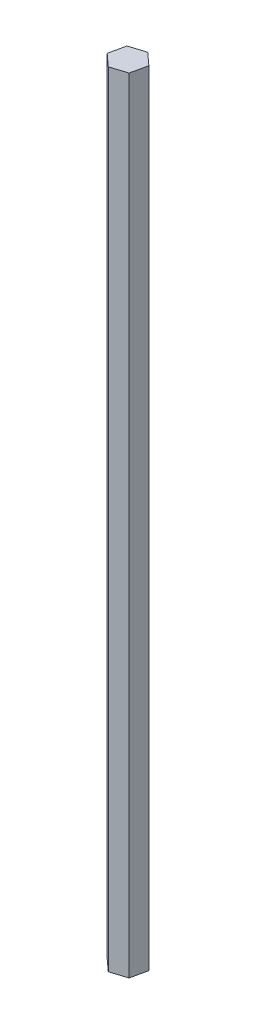
ISO-10303-21;
HEADER;
FILE_DESCRIPTION(('STEP AP214'),'2;1');
FILE_NAME('part.step','',(''),(''),'','','');
FILE_SCHEMA(('AUTOMOTIVE_DESIGN { 1 0 10303 214 1 1 1 1 }'));
ENDSEC;
DATA;
#1=APPLICATION_CONTEXT('core data for automotive mechanical design processes');
#2=APPLICATION_PROTOCOL_DEFINITION('international standard','automotive_design',2000,#1);
#3=PRODUCT_CONTEXT('',#1,'mechanical');
#4=PRODUCT('Part','Part','',(#3));
#5=PRODUCT_RELATED_PRODUCT_CATEGORY('part','',(#4));
#6=PRODUCT_DEFINITION_FORMATION('','',#4);
#7=PRODUCT_DEFINITION_CONTEXT('part definition',#1,'design');
#8=PRODUCT_DEFINITION('design','',#6,#7);
#9=PRODUCT_DEFINITION_SHAPE('','',#8);
#10=(LENGTH_UNIT() NAMED_UNIT(*) SI_UNIT(.MILLI.,.METRE.));
#11=(NAMED_UNIT(*) PLANE_ANGLE_UNIT() SI_UNIT($,.RADIAN.));
#12=(NAMED_UNIT(*) SI_UNIT($,.STERADIAN.) SOLID_ANGLE_UNIT());
#13=UNCERTAINTY_MEASURE_WITH_UNIT(LENGTH_MEASURE(1.E-05),#10,'distance_accuracy_value','');
#14=(GEOMETRIC_REPRESENTATION_CONTEXT(3) GLOBAL_UNCERTAINTY_ASSIGNED_CONTEXT((#13)) GLOBAL_UNIT_ASSIGNED_CONTEXT((#10,
#11,#12)) REPRESENTATION_CONTEXT('',''));
#15=CARTESIAN_POINT('',(0.,0.,0.));
#16=DIRECTION('',(0.,0.,1.));
#17=DIRECTION('',(1.,0.,0.));
#18=AXIS2_PLACEMENT_3D('',#15,#16,#17);
#19=CARTESIAN_POINT('',(-0.61182187926995,136.525,2.82117126764399));
#20=DIRECTION('',(-0.305094633460301,0.,-0.952322038300976));
#21=DIRECTION('',(-0.952322038300976,0.,0.305094633460301));
#22=AXIS2_PLACEMENT_3D('',#19,#20,#21);
#23=PLANE('',#22);
#24=DIRECTION('',(0.952322038300976,0.,-0.305094633460301));
#25=VECTOR('',#24,1.);
#26=CARTESIAN_POINT('',(-0.61182187926995,0.,2.82117126764399));
#27=LINE('',#26,#25);
#28=CARTESIAN_POINT('',(-0.61182187926995,0.,2.82117126764399));
#29=VERTEX_POINT('',#28);
#30=CARTESIAN_POINT('',(2.13729504657146,0.,1.94043892386091));
#31=VERTEX_POINT('',#30);
#32=EDGE_CURVE('E117',#29,#31,#27,.T.);
#33=ORIENTED_EDGE('',*,*,#32,.T.);
#34=DIRECTION('',(0.,-1.,0.));
#35=VECTOR('',#34,1.);
#36=CARTESIAN_POINT('',(2.13729504657146,136.525,1.94043892386091));
#37=LINE('',#36,#35);
#38=CARTESIAN_POINT('',(2.13729504657146,136.525,1.94043892386091));
#39=VERTEX_POINT('',#38);
#40=EDGE_CURVE('E11',#39,#31,#37,.T.);
#41=ORIENTED_EDGE('',*,*,#40,.F.);
#42=DIRECTION('',(0.952322038300976,0.,-0.305094633460301));
#43=VECTOR('',#42,1.);
#44=CARTESIAN_POINT('',(-0.61182187926995,136.525,2.82117126764399));
#45=LINE('',#44,#43);
#46=CARTESIAN_POINT('',(-0.61182187926995,136.525,2.82117126764399));
#47=VERTEX_POINT('',#46);
#48=EDGE_CURVE('E127',#47,#39,#45,.T.);
#49=ORIENTED_EDGE('',*,*,#48,.F.);
#50=DIRECTION('',(0.,-1.,0.));
#51=VECTOR('',#50,1.);
#52=CARTESIAN_POINT('',(-0.61182187926995,136.525,2.82117126764399));
#53=LINE('',#52,#51);
#54=EDGE_CURVE('E113',#47,#29,#53,.T.);
#55=ORIENTED_EDGE('',*,*,#54,.T.);
#56=EDGE_LOOP('',(#33,#41,#49,#55));
#57=FACE_BOUND('',#56,.T.);
#58=ADVANCED_FACE('F33',(#57),#23,.F.);
#59=CARTESIAN_POINT('',(2.13729504657146,136.525,1.94043892386091));
#60=DIRECTION('',(-0.977282394482572,0.,-0.211941316015566));
#61=DIRECTION('',(-0.211941316015566,0.,0.977282394482572));
#62=AXIS2_PLACEMENT_3D('',#59,#60,#61);
#63=PLANE('',#62);
#64=DIRECTION('',(0.211941316015566,0.,-0.977282394482572));
#65=VECTOR('',#64,1.);
#66=CARTESIAN_POINT('',(2.13729504657146,0.,1.94043892386091));
#67=LINE('',#66,#65);
#68=CARTESIAN_POINT('',(2.74911692584142,0.,-0.880732343783076));
#69=VERTEX_POINT('',#68);
#70=EDGE_CURVE('E120',#31,#69,#67,.T.);
#71=ORIENTED_EDGE('',*,*,#70,.T.);
#72=DIRECTION('',(0.,-1.,0.));
#73=VECTOR('',#72,1.);
#74=CARTESIAN_POINT('',(2.74911692584142,136.525,-0.880732343783076));
#75=LINE('',#74,#73);
#76=CARTESIAN_POINT('',(2.74911692584142,136.525,-0.880732343783076));
#77=VERTEX_POINT('',#76);
#78=EDGE_CURVE('E41',#77,#69,#75,.T.);
#79=ORIENTED_EDGE('',*,*,#78,.F.);
#80=DIRECTION('',(0.211941316015566,0.,-0.977282394482572));
#81=VECTOR('',#80,1.);
#82=CARTESIAN_POINT('',(2.13729504657146,136.525,1.94043892386091));
#83=LINE('',#82,#81);
#84=EDGE_CURVE('E86',#39,#77,#83,.T.);
#85=ORIENTED_EDGE('',*,*,#84,.F.);
#86=ORIENTED_EDGE('',*,*,#40,.T.);
#87=EDGE_LOOP('',(#71,#79,#85,#86));
#88=FACE_BOUND('',#87,.T.);
#89=ADVANCED_FACE('F151',(#88),#63,.F.);
#90=CARTESIAN_POINT('',(2.74911692584142,136.525,-0.880732343783076));
#91=DIRECTION('',(-0.672187761022271,0.,0.74038072228541));
#92=DIRECTION('',(0.74038072228541,0.,0.672187761022271));
#93=AXIS2_PLACEMENT_3D('',#90,#91,#92);
#94=PLANE('',#93);
#95=DIRECTION('',(-0.74038072228541,0.,-0.672187761022271));
#96=VECTOR('',#95,1.);
#97=CARTESIAN_POINT('',(2.74911692584142,0.,-0.880732343783076));
#98=LINE('',#97,#96);
#99=CARTESIAN_POINT('',(0.611821879269952,0.,-2.82117126764399));
#100=VERTEX_POINT('',#99);
#101=EDGE_CURVE('E122',#69,#100,#98,.T.);
#102=ORIENTED_EDGE('',*,*,#101,.T.);
#103=DIRECTION('',(0.,-1.,0.));
#104=VECTOR('',#103,1.);
#105=CARTESIAN_POINT('',(0.611821879269952,136.525,-2.82117126764399));
#106=LINE('',#105,#104);
#107=CARTESIAN_POINT('',(0.611821879269952,136.525,-2.82117126764399));
#108=VERTEX_POINT('',#107);
#109=EDGE_CURVE('E108',#108,#100,#106,.T.);
#110=ORIENTED_EDGE('',*,*,#109,.F.);
#111=DIRECTION('',(-0.74038072228541,0.,-0.672187761022271));
#112=VECTOR('',#111,1.);
#113=CARTESIAN_POINT('',(2.74911692584142,136.525,-0.880732343783076));
#114=LINE('',#113,#112);
#115=EDGE_CURVE('E99',#77,#108,#114,.T.);
#116=ORIENTED_EDGE('',*,*,#115,.F.);
#117=ORIENTED_EDGE('',*,*,#78,.T.);
#118=EDGE_LOOP('',(#102,#110,#116,#117));
#119=FACE_BOUND('',#118,.T.);
#120=ADVANCED_FACE('F133',(#119),#94,.F.);
#121=CARTESIAN_POINT('',(0.611821879269952,136.525,-2.82117126764399));
#122=DIRECTION('',(0.305094633460301,0.,0.952322038300976));
#123=DIRECTION('',(0.952322038300976,0.,-0.305094633460301));
#124=AXIS2_PLACEMENT_3D('',#121,#122,#123);
#125=PLANE('',#124);
#126=DIRECTION('',(-0.952322038300976,0.,0.305094633460301));
#127=VECTOR('',#126,1.);
#128=CARTESIAN_POINT('',(0.611821879269952,0.,-2.82117126764399));
#129=LINE('',#128,#127);
#130=CARTESIAN_POINT('',(-2.13729504657146,0.,-1.94043892386091));
#131=VERTEX_POINT('',#130);
#132=EDGE_CURVE('E107',#100,#131,#129,.T.);
#133=ORIENTED_EDGE('',*,*,#132,.T.);
#134=DIRECTION('',(0.,-1.,0.));
#135=VECTOR('',#134,1.);
#136=CARTESIAN_POINT('',(-2.13729504657146,136.525,-1.94043892386091));
#137=LINE('',#136,#135);
#138=CARTESIAN_POINT('',(-2.13729504657146,136.525,-1.94043892386091));
#139=VERTEX_POINT('',#138);
#140=EDGE_CURVE('E104',#139,#131,#137,.T.);
#141=ORIENTED_EDGE('',*,*,#140,.F.);
#142=DIRECTION('',(-0.952322038300976,0.,0.305094633460301));
#143=VECTOR('',#142,1.);
#144=CARTESIAN_POINT('',(0.611821879269952,136.525,-2.82117126764399));
#145=LINE('',#144,#143);
#146=EDGE_CURVE('E93',#108,#139,#145,.T.);
#147=ORIENTED_EDGE('',*,*,#146,.F.);
#148=ORIENTED_EDGE('',*,*,#109,.T.);
#149=EDGE_LOOP('',(#133,#141,#147,#148));
#150=FACE_BOUND('',#149,.T.);
#151=ADVANCED_FACE('F105',(#150),#125,.F.);
#152=CARTESIAN_POINT('',(-2.13729504657146,136.525,-1.94043892386091));
#153=DIRECTION('',(0.977282394482573,0.,0.211941316015565));
#154=DIRECTION('',(0.211941316015565,0.,-0.977282394482573));
#155=AXIS2_PLACEMENT_3D('',#152,#153,#154);
#156=PLANE('',#155);
#157=DIRECTION('',(-0.211941316015565,0.,0.977282394482572));
#158=VECTOR('',#157,1.);
#159=CARTESIAN_POINT('',(-2.13729504657146,0.,-1.94043892386091));
#160=LINE('',#159,#158);
#161=CARTESIAN_POINT('',(-2.74911692584141,0.,0.88073234378308));
#162=VERTEX_POINT('',#161);
#163=EDGE_CURVE('E72',#131,#162,#160,.T.);
#164=ORIENTED_EDGE('',*,*,#163,.T.);
#165=DIRECTION('',(0.,-1.,0.));
#166=VECTOR('',#165,1.);
#167=CARTESIAN_POINT('',(-2.74911692584141,136.525,0.88073234378308));
#168=LINE('',#167,#166);
#169=CARTESIAN_POINT('',(-2.74911692584141,136.525,0.88073234378308));
#170=VERTEX_POINT('',#169);
#171=EDGE_CURVE('E109',#170,#162,#168,.T.);
#172=ORIENTED_EDGE('',*,*,#171,.F.);
#173=DIRECTION('',(-0.211941316015565,0.,0.977282394482572));
#174=VECTOR('',#173,1.);
#175=CARTESIAN_POINT('',(-2.13729504657146,136.525,-1.94043892386091));
#176=LINE('',#175,#174);
#177=EDGE_CURVE('E97',#139,#170,#176,.T.);
#178=ORIENTED_EDGE('',*,*,#177,.F.);
#179=ORIENTED_EDGE('',*,*,#140,.T.);
#180=EDGE_LOOP('',(#164,#172,#178,#179));
#181=FACE_BOUND('',#180,.T.);
#182=ADVANCED_FACE('F111',(#181),#156,.F.);
#183=CARTESIAN_POINT('',(-2.74911692584141,136.525,0.88073234378308));
#184=DIRECTION('',(0.672187761022271,0.,-0.740380722285411));
#185=DIRECTION('',(-0.740380722285411,0.,-0.672187761022271));
#186=AXIS2_PLACEMENT_3D('',#183,#184,#185);
#187=PLANE('',#186);
#188=DIRECTION('',(0.740380722285411,0.,0.672187761022271));
#189=VECTOR('',#188,1.);
#190=CARTESIAN_POINT('',(-2.74911692584141,0.,0.88073234378308));
#191=LINE('',#190,#189);
#192=EDGE_CURVE('E78',#162,#29,#191,.T.);
#193=ORIENTED_EDGE('',*,*,#192,.T.);
#194=ORIENTED_EDGE('',*,*,#54,.F.);
#195=DIRECTION('',(0.740380722285411,0.,0.672187761022271));
#196=VECTOR('',#195,1.);
#197=CARTESIAN_POINT('',(-2.74911692584141,136.525,0.88073234378308));
#198=LINE('',#197,#196);
#199=EDGE_CURVE('E49',#170,#47,#198,.T.);
#200=ORIENTED_EDGE('',*,*,#199,.F.);
#201=ORIENTED_EDGE('',*,*,#171,.T.);
#202=EDGE_LOOP('',(#193,#194,#200,#201));
#203=FACE_BOUND('',#202,.T.);
#204=ADVANCED_FACE('F140',(#203),#187,.F.);
#205=CARTESIAN_POINT('',(0.,136.525,0.));
#206=DIRECTION('',(0.,1.,0.));
#207=DIRECTION('',(0.,0.,1.));
#208=AXIS2_PLACEMENT_3D('',#205,#206,#207);
#209=PLANE('',#208);
#210=ORIENTED_EDGE('',*,*,#48,.T.);
#211=ORIENTED_EDGE('',*,*,#84,.T.);
#212=ORIENTED_EDGE('',*,*,#115,.T.);
#213=ORIENTED_EDGE('',*,*,#146,.T.);
#214=ORIENTED_EDGE('',*,*,#177,.T.);
#215=ORIENTED_EDGE('',*,*,#199,.T.);
#216=EDGE_LOOP('',(#210,#211,#212,#213,#214,#215));
#217=FACE_BOUND('',#216,.T.);
#218=ADVANCED_FACE('F95',(#217),#209,.T.);
#219=CARTESIAN_POINT('',(0.,0.,0.));
#220=DIRECTION('',(0.,1.,0.));
#221=DIRECTION('',(0.,0.,1.));
#222=AXIS2_PLACEMENT_3D('',#219,#220,#221);
#223=PLANE('',#222);
#224=ORIENTED_EDGE('',*,*,#32,.F.);
#225=ORIENTED_EDGE('',*,*,#192,.F.);
#226=ORIENTED_EDGE('',*,*,#163,.F.);
#227=ORIENTED_EDGE('',*,*,#132,.F.);
#228=ORIENTED_EDGE('',*,*,#101,.F.);
#229=ORIENTED_EDGE('',*,*,#70,.F.);
#230=EDGE_LOOP('',(#224,#225,#226,#227,#228,#229));
#231=FACE_BOUND('',#230,.T.);
#232=ADVANCED_FACE('F136',(#231),#223,.F.);
#233=CLOSED_SHELL('',(#58,#89,#120,#151,#182,#204,#218,#232));
#234=MANIFOLD_SOLID_BREP('B2',#233);
#235=ADVANCED_BREP_SHAPE_REPRESENTATION('',(#18,#234),#14);
#236=SHAPE_DEFINITION_REPRESENTATION(#9,#235);
ENDSEC;
END-ISO-10303-21;
